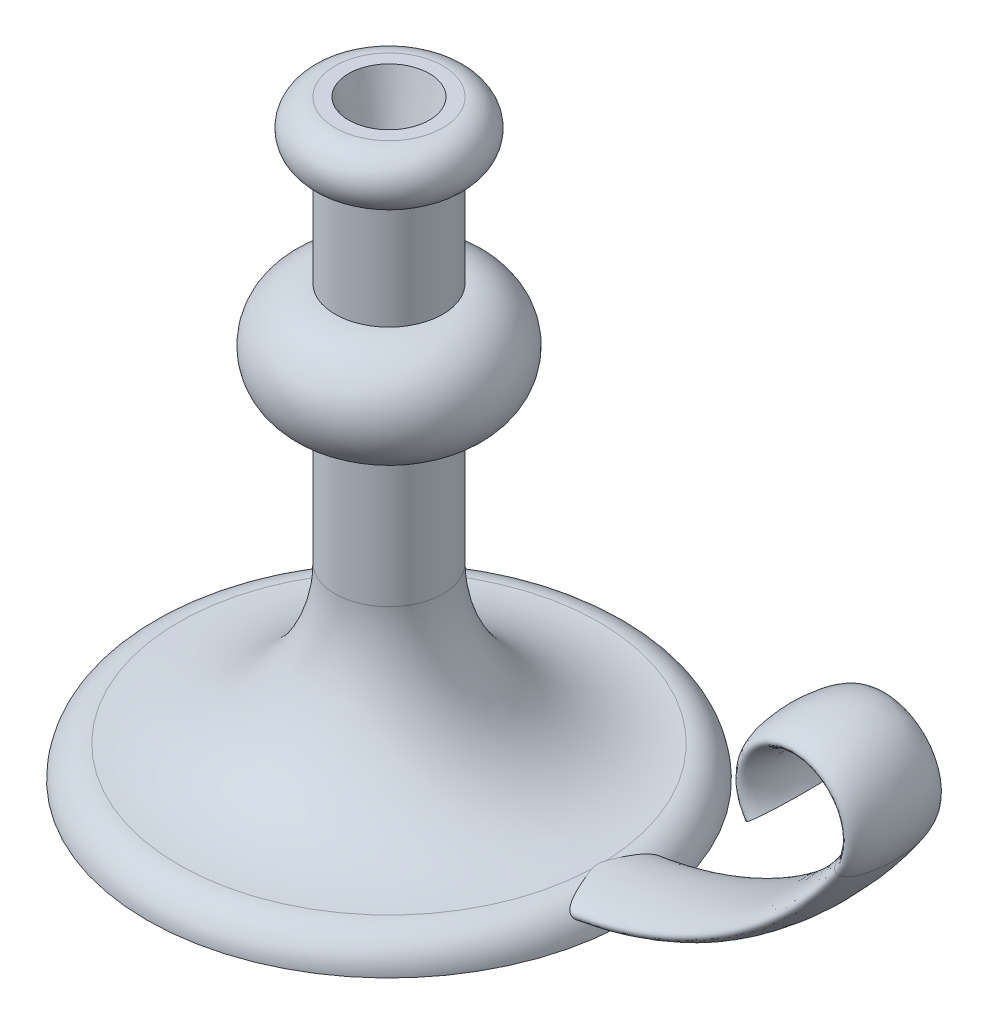
ISO-10303-21;
HEADER;
FILE_DESCRIPTION(('STEP AP214'),'2;1');
FILE_NAME('part.step','',(''),(''),'','','');
FILE_SCHEMA(('AUTOMOTIVE_DESIGN { 1 0 10303 214 1 1 1 1 }'));
ENDSEC;
DATA;
#1=APPLICATION_CONTEXT('core data for automotive mechanical design processes');
#2=APPLICATION_PROTOCOL_DEFINITION('international standard','automotive_design',2000,#1);
#3=PRODUCT_CONTEXT('',#1,'mechanical');
#4=PRODUCT('Part','Part','',(#3));
#5=PRODUCT_RELATED_PRODUCT_CATEGORY('part','',(#4));
#6=PRODUCT_DEFINITION_FORMATION('','',#4);
#7=PRODUCT_DEFINITION_CONTEXT('part definition',#1,'design');
#8=PRODUCT_DEFINITION('design','',#6,#7);
#9=PRODUCT_DEFINITION_SHAPE('','',#8);
#10=(LENGTH_UNIT() NAMED_UNIT(*) SI_UNIT(.MILLI.,.METRE.));
#11=(NAMED_UNIT(*) PLANE_ANGLE_UNIT() SI_UNIT($,.RADIAN.));
#12=(NAMED_UNIT(*) SI_UNIT($,.STERADIAN.) SOLID_ANGLE_UNIT());
#13=UNCERTAINTY_MEASURE_WITH_UNIT(LENGTH_MEASURE(1.E-05),#10,'distance_accuracy_value','');
#14=(GEOMETRIC_REPRESENTATION_CONTEXT(3) GLOBAL_UNCERTAINTY_ASSIGNED_CONTEXT((#13)) GLOBAL_UNIT_ASSIGNED_CONTEXT((#10,
#11,#12)) REPRESENTATION_CONTEXT('',''));
#15=CARTESIAN_POINT('',(0.,0.,0.));
#16=DIRECTION('',(0.,0.,1.));
#17=DIRECTION('',(1.,0.,0.));
#18=AXIS2_PLACEMENT_3D('',#15,#16,#17);
#19=CARTESIAN_POINT('',(0.,0.,0.));
#20=DIRECTION('',(0.,-1.,0.));
#21=DIRECTION('',(0.,0.,-1.));
#22=AXIS2_PLACEMENT_3D('',#19,#20,#21);
#23=PLANE('',#22);
#24=CARTESIAN_POINT('',(0.,0.,0.));
#25=DIRECTION('',(0.,-1.,0.));
#26=DIRECTION('',(0.,0.,-1.));
#27=AXIS2_PLACEMENT_3D('',#24,#25,#26);
#28=CIRCLE('',#27,90.);
#29=CARTESIAN_POINT('',(0.,0.,-90.));
#30=VERTEX_POINT('',#29);
#31=EDGE_CURVE('E69',#30,#30,#28,.T.);
#32=ORIENTED_EDGE('',*,*,#31,.T.);
#33=EDGE_LOOP('',(#32));
#34=FACE_BOUND('',#33,.T.);
#35=ADVANCED_FACE('F41',(#34),#23,.T.);
#36=CARTESIAN_POINT('',(0.,220.,0.));
#37=DIRECTION('',(0.,1.,0.));
#38=DIRECTION('',(0.,0.,1.));
#39=AXIS2_PLACEMENT_3D('',#36,#37,#38);
#40=PLANE('',#39);
#41=CARTESIAN_POINT('',(0.,220.,0.));
#42=DIRECTION('',(0.,1.,0.));
#43=DIRECTION('',(0.,0.,1.));
#44=AXIS2_PLACEMENT_3D('',#41,#42,#43);
#45=CIRCLE('',#44,15.);
#46=CARTESIAN_POINT('',(0.,220.,15.));
#47=VERTEX_POINT('',#46);
#48=EDGE_CURVE('E95',#47,#47,#45,.T.);
#49=ORIENTED_EDGE('',*,*,#48,.F.);
#50=EDGE_LOOP('',(#49));
#51=FACE_BOUND('',#50,.T.);
#52=CARTESIAN_POINT('',(0.,220.,0.));
#53=DIRECTION('',(0.,-1.,0.));
#54=DIRECTION('',(0.,0.,-1.));
#55=AXIS2_PLACEMENT_3D('',#52,#53,#54);
#56=CIRCLE('',#55,20.);
#57=CARTESIAN_POINT('',(0.,220.,-20.));
#58=VERTEX_POINT('',#57);
#59=EDGE_CURVE('E55',#58,#58,#56,.T.);
#60=ORIENTED_EDGE('',*,*,#59,.F.);
#61=EDGE_LOOP('',(#60));
#62=FACE_BOUND('',#61,.T.);
#63=ADVANCED_FACE('F138',(#51,#62),#40,.T.);
#64=CARTESIAN_POINT('',(0.,210.,0.));
#65=DIRECTION('',(0.,-1.,0.));
#66=DIRECTION('',(0.,0.,-1.));
#67=AXIS2_PLACEMENT_3D('',#64,#65,#66);
#68=TOROIDAL_SURFACE('',#67,20.,10.);
#69=ORIENTED_EDGE('',*,*,#59,.T.);
#70=EDGE_LOOP('',(#69));
#71=FACE_BOUND('',#70,.T.);
#72=CARTESIAN_POINT('',(0.,200.,0.));
#73=DIRECTION('',(0.,-1.,0.));
#74=DIRECTION('',(0.,0.,-1.));
#75=AXIS2_PLACEMENT_3D('',#72,#73,#74);
#76=CIRCLE('',#75,20.);
#77=CARTESIAN_POINT('',(0.,200.,-20.));
#78=VERTEX_POINT('',#77);
#79=EDGE_CURVE('E159',#78,#78,#76,.T.);
#80=ORIENTED_EDGE('',*,*,#79,.F.);
#81=EDGE_LOOP('',(#80));
#82=FACE_BOUND('',#81,.T.);
#83=ADVANCED_FACE('F143',(#71,#82),#68,.T.);
#84=CARTESIAN_POINT('',(0.,0.,0.));
#85=DIRECTION('',(0.,-1.,0.));
#86=DIRECTION('',(0.,0.,-1.));
#87=AXIS2_PLACEMENT_3D('',#84,#85,#86);
#88=CYLINDRICAL_SURFACE('',#87,20.);
#89=ORIENTED_EDGE('',*,*,#79,.T.);
#90=EDGE_LOOP('',(#89));
#91=FACE_BOUND('',#90,.T.);
#92=CARTESIAN_POINT('',(0.,160.,0.));
#93=DIRECTION('',(0.,-1.,0.));
#94=DIRECTION('',(0.,0.,-1.));
#95=AXIS2_PLACEMENT_3D('',#92,#93,#94);
#96=CIRCLE('',#95,20.);
#97=CARTESIAN_POINT('',(0.,160.,-20.));
#98=VERTEX_POINT('',#97);
#99=EDGE_CURVE('E155',#98,#98,#96,.T.);
#100=ORIENTED_EDGE('',*,*,#99,.F.);
#101=EDGE_LOOP('',(#100));
#102=FACE_BOUND('',#101,.T.);
#103=ADVANCED_FACE('F170',(#91,#102),#88,.T.);
#104=CARTESIAN_POINT('',(0.,140.,0.));
#105=DIRECTION('',(0.,-1.,0.));
#106=DIRECTION('',(0.,0.,-1.));
#107=AXIS2_PLACEMENT_3D('',#104,#105,#106);
#108=DEGENERATE_TOROIDAL_SURFACE('',#107,20.,20.,.T.);
#109=ORIENTED_EDGE('',*,*,#99,.T.);
#110=EDGE_LOOP('',(#109));
#111=FACE_BOUND('',#110,.T.);
#112=CARTESIAN_POINT('',(0.,120.,0.));
#113=DIRECTION('',(0.,-1.,0.));
#114=DIRECTION('',(0.,0.,-1.));
#115=AXIS2_PLACEMENT_3D('',#112,#113,#114);
#116=CIRCLE('',#115,20.);
#117=CARTESIAN_POINT('',(0.,120.,-20.));
#118=VERTEX_POINT('',#117);
#119=EDGE_CURVE('E151',#118,#118,#116,.T.);
#120=ORIENTED_EDGE('',*,*,#119,.F.);
#121=EDGE_LOOP('',(#120));
#122=FACE_BOUND('',#121,.T.);
#123=ADVANCED_FACE('F176',(#111,#122),#108,.T.);
#124=CARTESIAN_POINT('',(0.,0.,0.));
#125=DIRECTION('',(0.,-1.,0.));
#126=DIRECTION('',(0.,0.,-1.));
#127=AXIS2_PLACEMENT_3D('',#124,#125,#126);
#128=CYLINDRICAL_SURFACE('',#127,20.);
#129=ORIENTED_EDGE('',*,*,#119,.T.);
#130=EDGE_LOOP('',(#129));
#131=FACE_BOUND('',#130,.T.);
#132=CARTESIAN_POINT('',(0.,70.,0.));
#133=DIRECTION('',(0.,-1.,0.));
#134=DIRECTION('',(0.,0.,-1.));
#135=AXIS2_PLACEMENT_3D('',#132,#133,#134);
#136=CIRCLE('',#135,20.);
#137=CARTESIAN_POINT('',(0.,70.,-20.));
#138=VERTEX_POINT('',#137);
#139=EDGE_CURVE('E68',#138,#138,#136,.T.);
#140=ORIENTED_EDGE('',*,*,#139,.F.);
#141=EDGE_LOOP('',(#140));
#142=FACE_BOUND('',#141,.T.);
#143=ADVANCED_FACE('F136',(#131,#142),#128,.T.);
#144=CARTESIAN_POINT('',(0.,70.,0.));
#145=DIRECTION('',(0.,-1.,0.));
#146=DIRECTION('',(0.,0.,-1.));
#147=AXIS2_PLACEMENT_3D('',#144,#145,#146);
#148=TOROIDAL_SURFACE('',#147,78.132526458804,58.132526458804);
#149=CARTESIAN_POINT('',(78.0829144180408,11.867473541196,-2.78391214312258));
#150=CARTESIAN_POINT('',(78.0034178417161,11.8674839988395,-2.56875903160674));
#151=CARTESIAN_POINT('',(77.9332196184629,11.8676699524661,-2.35017667179376));
#152=CARTESIAN_POINT('',(77.811805042004,11.868194388353,-1.90784794183037));
#153=CARTESIAN_POINT('',(77.7605849191874,11.868532840293,-1.68410260658854));
#154=CARTESIAN_POINT('',(77.6786784850846,11.869154868186,-1.23956128413428));
#155=CARTESIAN_POINT('',(77.6474424557957,11.8694397455078,-1.01886640772483));
#156=CARTESIAN_POINT('',(77.6033658733518,11.8698601874895,-0.575640526980788));
#157=CARTESIAN_POINT('',(77.5905263444912,11.8699957438354,-0.353109421100969));
#158=CARTESIAN_POINT('',(77.5829791210356,11.8700736774626,0.113314758134888));
#159=CARTESIAN_POINT('',(77.5900991076185,11.8699965934252,0.357239719211034));
#160=CARTESIAN_POINT('',(77.6264217338159,11.8696368687455,0.8434491291199));
#161=CARTESIAN_POINT('',(77.6556268809198,11.8693542047624,1.08573338852002));
#162=CARTESIAN_POINT('',(77.7372563767673,11.868695649815,1.57451497171925));
#163=CARTESIAN_POINT('',(77.7904048790381,11.8683170262126,1.8208931030878));
#164=CARTESIAN_POINT('',(77.8873061225065,11.8678591917707,2.1858254435987));
#165=CARTESIAN_POINT('',(77.9224776324587,11.8677249159516,2.30671879205611));
#166=CARTESIAN_POINT('',(77.9984741417738,11.8675323896527,2.5467153675248));
#167=CARTESIAN_POINT('',(78.0392991425871,11.8674741391925,2.66581859407688));
#168=CARTESIAN_POINT('',(78.0829144180408,11.867473541196,2.78391214312255));
#169=B_SPLINE_CURVE_WITH_KNOTS('',3,(#149,#150,#151,#152,#153,#154,#155,#156,#157,#158,#159,
#160,#161,#162,#163,#164,#165,#166,#167,#168),.UNSPECIFIED.,.F.,.F.,(4,2,2,2,2,2,2,2,2,4),(0.,
0.687891249862493,1.37564579087687,2.04356060088577,2.71151259811932,3.44257184885006,
4.17371411453313,4.92863144645206,5.30622841442645,5.68382547926132),.UNSPECIFIED.);
#170=CARTESIAN_POINT('',(78.0829144180408,11.867473541196,-2.78391214312256));
#171=VERTEX_POINT('',#170);
#172=CARTESIAN_POINT('',(78.0829144180408,11.867473541196,2.78391214312251));
#173=VERTEX_POINT('',#172);
#174=EDGE_CURVE('E71',#171,#173,#169,.T.);
#175=ORIENTED_EDGE('',*,*,#174,.F.);
#176=CARTESIAN_POINT('',(0.,11.867473541196,0.));
#177=DIRECTION('',(0.,-1.,0.));
#178=DIRECTION('',(0.,0.,-1.));
#179=AXIS2_PLACEMENT_3D('',#176,#177,#178);
#180=CIRCLE('',#179,78.132526458804);
#181=EDGE_CURVE('E61',#173,#171,#180,.T.);
#182=ORIENTED_EDGE('',*,*,#181,.F.);
#183=EDGE_LOOP('',(#175,#182));
#184=FACE_BOUND('',#183,.T.);
#185=ORIENTED_EDGE('',*,*,#139,.T.);
#186=EDGE_LOOP('',(#185));
#187=FACE_BOUND('',#186,.T.);
#188=ADVANCED_FACE('F72',(#184,#187),#148,.F.);
#189=CARTESIAN_POINT('',(0.,0.,0.));
#190=DIRECTION('',(0.,-1.,0.));
#191=DIRECTION('',(0.,0.,-1.));
#192=AXIS2_PLACEMENT_3D('',#189,#190,#191);
#193=TOROIDAL_SURFACE('',#192,78.132526458804,11.867473541196);
#194=CARTESIAN_POINT('',(78.0829144180408,11.867473541196,2.78391214312251));
#195=CARTESIAN_POINT('',(78.1332858205503,11.8674759985882,2.92022664744843));
#196=CARTESIAN_POINT('',(78.1840686851779,11.8670886000006,3.05638794075109));
#197=CARTESIAN_POINT('',(78.2861981859076,11.8654881673345,3.3284936679438));
#198=CARTESIAN_POINT('',(78.337544819978,11.8642751362302,3.46443810261328));
#199=CARTESIAN_POINT('',(78.440592063587,11.8609759471981,3.73632991718496));
#200=CARTESIAN_POINT('',(78.49229296339,11.8588889597795,3.87227717686807));
#201=CARTESIAN_POINT('',(78.5958582066355,11.8538068441193,4.14409235409665));
#202=CARTESIAN_POINT('',(78.6477225502213,11.8508117150809,4.27996027157239));
#203=CARTESIAN_POINT('',(78.8034675333041,11.8404115348024,4.68767200254305));
#204=CARTESIAN_POINT('',(78.9074334947624,11.8315937289644,4.95944887114404));
#205=CARTESIAN_POINT('',(79.1151922799917,11.8099544577082,5.50302509401507));
#206=CARTESIAN_POINT('',(79.2189850254412,11.7971315117002,5.77482441937878));
#207=CARTESIAN_POINT('',(79.4262222433445,11.7672443080693,6.31836420650816));
#208=CARTESIAN_POINT('',(79.5296666694147,11.7501795065917,6.59010465625045));
#209=CARTESIAN_POINT('',(79.7373630561895,11.7113283911726,7.1364972016642));
#210=CARTESIAN_POINT('',(79.8416108150557,11.6894905701872,7.41114725070465));
#211=CARTESIAN_POINT('',(80.0498141920577,11.6409039389752,7.96006818154131));
#212=CARTESIAN_POINT('',(80.1537698596935,11.6141560190807,8.23433912301035));
#213=CARTESIAN_POINT('',(80.3615705733899,11.5553875575139,8.7822789310992));
#214=CARTESIAN_POINT('',(80.4654156410094,11.5233683722242,9.05594793429787));
#215=CARTESIAN_POINT('',(80.6732691346772,11.4536206608184,9.60241678337918));
#216=CARTESIAN_POINT('',(80.7772775118252,11.4158936056617,9.8752168347561));
#217=CARTESIAN_POINT('',(80.9858374144413,11.334191725825,10.4196321677995));
#218=CARTESIAN_POINT('',(81.0903888590435,11.2902178070196,10.6912476153727));
#219=CARTESIAN_POINT('',(81.2826479104597,11.2034206554867,11.1867615452376));
#220=CARTESIAN_POINT('',(81.3701930086615,11.1616759149781,11.410911666338));
#221=CARTESIAN_POINT('',(81.5463686891743,11.0729356336802,11.8577708897263));
#222=CARTESIAN_POINT('',(81.6349993656717,11.0259396343683,12.0804798643789));
#223=CARTESIAN_POINT('',(81.8138194139794,10.9260934431771,12.5240498252789));
#224=CARTESIAN_POINT('',(81.9040092978742,10.8732412959291,12.7449101676321));
#225=CARTESIAN_POINT('',(82.0864803188138,10.7609628934924,13.1840394622447));
#226=CARTESIAN_POINT('',(82.1787610235362,10.7015379876754,13.4023089362521));
#227=CARTESIAN_POINT('',(82.3661640345518,10.5751661358235,13.8353732829513));
#228=CARTESIAN_POINT('',(82.4612856309817,10.5082210575245,14.0501690033024));
#229=CARTESIAN_POINT('',(82.6553445356343,10.3655856023384,14.4749757857705));
#230=CARTESIAN_POINT('',(82.7542797001199,10.2899000923293,14.6849894334044));
#231=CARTESIAN_POINT('',(82.9325248212082,10.1478781212611,15.0477988055398));
#232=CARTESIAN_POINT('',(83.0107123856304,10.0837864593731,15.2020195398539));
#233=CARTESIAN_POINT('',(83.1708954269159,9.94865203519248,15.5054871547856));
#234=CARTESIAN_POINT('',(83.2528923910753,9.87760654574407,15.6547320529667));
#235=CARTESIAN_POINT('',(83.4213168469832,9.72769213079579,15.9457218062268));
#236=CARTESIAN_POINT('',(83.5077243859348,9.64885714942943,16.0874954044401));
#237=CARTESIAN_POINT('',(83.6864528949685,9.48170334086076,16.361274891524));
#238=CARTESIAN_POINT('',(83.7787675581541,9.39339456261682,16.4932908841141));
#239=CARTESIAN_POINT('',(83.956401145631,9.21963534746911,16.7243891785783));
#240=CARTESIAN_POINT('',(84.0406677737753,9.13577114577394,16.8254331104551));
#241=CARTESIAN_POINT('',(84.1718277558071,9.00305417732087,16.9662248372236));
#242=CARTESIAN_POINT('',(84.2163788462501,8.95762240687117,17.0113917015562));
#243=CARTESIAN_POINT('',(84.3071572532483,8.86435477304841,17.0974102559331));
#244=CARTESIAN_POINT('',(84.3533848684972,8.81651848068836,17.1382611719143));
#245=CARTESIAN_POINT('',(84.4482733429297,8.71765998061532,17.2154157756223));
#246=CARTESIAN_POINT('',(84.4969609608077,8.66659962846712,17.2516382903156));
#247=CARTESIAN_POINT('',(84.5959984767066,8.56210210962373,17.3177794650122));
#248=CARTESIAN_POINT('',(84.6463473037986,8.50866646677419,17.3477020979264));
#249=CARTESIAN_POINT('',(84.7483991104385,8.39979466237416,17.4001728360828));
#250=CARTESIAN_POINT('',(84.8000979608695,8.34436444072553,17.4227411029409));
#251=CARTESIAN_POINT('',(84.904606191607,8.23183948066789,17.4596482337605));
#252=CARTESIAN_POINT('',(84.9574150400769,8.17474553455662,17.4739909497031));
#253=CARTESIAN_POINT('',(85.0496996712227,8.07465129447633,17.491154771647));
#254=CARTESIAN_POINT('',(85.0890472091098,8.03187375514774,17.4960090177583));
#255=CARTESIAN_POINT('',(85.1677986427243,7.94610098292568,17.5007001197072));
#256=CARTESIAN_POINT('',(85.2072025279551,7.90310578753893,17.5005378124247));
#257=CARTESIAN_POINT('',(85.2858069971304,7.81722558918855,17.4951751236272));
#258=CARTESIAN_POINT('',(85.3250075342474,7.77434061266189,17.4899736293093));
#259=CARTESIAN_POINT('',(85.4029280946959,7.68902725455244,17.474666642996));
#260=CARTESIAN_POINT('',(85.4416480888576,7.64659890070804,17.4645608547797));
#261=CARTESIAN_POINT('',(85.5563443502292,7.52087513940319,17.4273523856781));
#262=CARTESIAN_POINT('',(85.631317253979,7.43863707796102,17.3933227125755));
#263=CARTESIAN_POINT('',(85.7771695059256,7.27878151652804,17.3096535949428));
#264=CARTESIAN_POINT('',(85.848045901393,7.20116734819203,17.2600030530961));
#265=CARTESIAN_POINT('',(86.0324323694524,6.99964451691603,17.1099514783304));
#266=CARTESIAN_POINT('',(86.1418420675393,6.88049495365715,16.9980987061639));
#267=CARTESIAN_POINT('',(86.296785592954,6.71260018626944,16.8133206247178));
#268=CARTESIAN_POINT('',(86.3469968828002,6.65834176496262,16.7487472496471));
#269=CARTESIAN_POINT('',(86.444619704994,6.55314440736801,16.6149334305057));
#270=CARTESIAN_POINT('',(86.4920318183417,6.50220478199867,16.5456939613688));
#271=CARTESIAN_POINT('',(86.6286181671464,6.35589514832335,16.3351179437607));
#272=CARTESIAN_POINT('',(86.7141536424315,6.26485627327341,16.1884230072953));
#273=CARTESIAN_POINT('',(86.8770843399172,6.09248852543153,15.8851016516813));
#274=CARTESIAN_POINT('',(86.9544711948755,6.01116962203508,15.7284652837814));
#275=CARTESIAN_POINT('',(87.1025475226786,5.85651903770118,15.4077703114903));
#276=CARTESIAN_POINT('',(87.1732211383789,5.78320620946138,15.2436954229642));
#277=CARTESIAN_POINT('',(87.3086763184139,5.64354093539106,14.9103751770391));
#278=CARTESIAN_POINT('',(87.3734603460299,5.5771855778473,14.7411320211687));
#279=CARTESIAN_POINT('',(87.5000072427105,5.44832985186805,14.3930271646988));
#280=CARTESIAN_POINT('',(87.5616017753118,5.38602680140933,14.2140319621912));
#281=CARTESIAN_POINT('',(87.6800789163603,5.26688451343781,13.8526773494805));
#282=CARTESIAN_POINT('',(87.7369607322456,5.21004619470047,13.6703173796867));
#283=CARTESIAN_POINT('',(87.8466111002026,5.1010891390858,13.3026500889995));
#284=CARTESIAN_POINT('',(87.8993732000969,5.04897778558835,13.117338671214));
#285=CARTESIAN_POINT('',(88.0011025301256,4.94903597157326,12.7445263525517));
#286=CARTESIAN_POINT('',(88.0500694369844,4.90120587568069,12.5570252667201));
#287=CARTESIAN_POINT('',(88.1918545853316,4.76340349979638,11.9915675439686));
#288=CARTESIAN_POINT('',(88.2794872791204,4.67918837567283,11.6108952544418));
#289=CARTESIAN_POINT('',(88.4431391187063,4.52325418478706,10.8432786097806));
#290=CARTESIAN_POINT('',(88.5191200897792,4.45157608984194,10.456318046235));
#291=CARTESIAN_POINT('',(88.6603959989167,4.31929642694951,9.67902198080352));
#292=CARTESIAN_POINT('',(88.7257020536162,4.25868332836108,9.28869044129987));
#293=CARTESIAN_POINT('',(88.8466564405423,4.14714292480802,8.5052709614834));
#294=CARTESIAN_POINT('',(88.9023069783831,4.09621340756295,8.11218367206934));
#295=CARTESIAN_POINT('',(89.0062715521613,4.00158579641787,7.31135768670015));
#296=CARTESIAN_POINT('',(89.0542978004733,3.95816744116994,6.90354888832833));
#297=CARTESIAN_POINT('',(89.1413768883764,3.87980264147868,6.08607779994615));
#298=CARTESIAN_POINT('',(89.18042771216,3.84485810008823,5.67641511459293));
#299=CARTESIAN_POINT('',(89.2499396951377,3.78287872225844,4.8557440677656));
#300=CARTESIAN_POINT('',(89.2804001986671,3.75584448957546,4.44473560599446));
#301=CARTESIAN_POINT('',(89.3460650003117,3.69771452494742,3.41769003908219));
#302=CARTESIAN_POINT('',(89.3761310631696,3.67125280804496,2.80105258752198));
#303=CARTESIAN_POINT('',(89.4182686885379,3.6342184315108,1.56668069973948));
#304=CARTESIAN_POINT('',(89.430339412896,3.62364651196338,0.948946213763159));
#305=CARTESIAN_POINT('',(89.4365949414496,3.61816432502569,-0.266238369004212));
#306=CARTESIAN_POINT('',(89.4313584069666,3.62274736033785,-0.863683249201871));
#307=CARTESIAN_POINT('',(89.4041704685681,3.64660426005269,-2.05802228538358));
#308=CARTESIAN_POINT('',(89.3822157496816,3.66588103801001,-2.65491630863662));
#309=CARTESIAN_POINT('',(89.3211910243096,3.71970928834563,-3.84742470271281));
#310=CARTESIAN_POINT('',(89.2821133005466,3.75426764814309,-4.44303837471157));
#311=CARTESIAN_POINT('',(89.1859366512918,3.83989473584046,-5.63371381328731));
#312=CARTESIAN_POINT('',(89.128775946006,3.89102007896777,-6.22876656764166));
#313=CARTESIAN_POINT('',(88.9952765371682,4.01149571621043,-7.41471976927656));
#314=CARTESIAN_POINT('',(88.9189448617358,4.08083933189544,-8.00562165684494));
#315=CARTESIAN_POINT('',(88.7886089282295,4.20060631678663,-8.88723405985461));
#316=CARTESIAN_POINT('',(88.7425427086701,4.24313632566967,-9.18021341272784));
#317=CARTESIAN_POINT('',(88.6447638466676,4.33395559779652,-9.76432515597012));
#318=CARTESIAN_POINT('',(88.5930515513723,4.38224450697238,-10.0554576587291));
#319=CARTESIAN_POINT('',(88.4833646726485,4.48535505123301,-10.6363431687204));
#320=CARTESIAN_POINT('',(88.4253712670681,4.54019637511359,-10.9260891520265));
#321=CARTESIAN_POINT('',(88.3026480536119,4.65710809885415,-11.5027659615388));
#322=CARTESIAN_POINT('',(88.2379168132693,4.71918003628156,-11.7896961748639));
#323=CARTESIAN_POINT('',(88.1008728878357,4.85166066720993,-12.3601403999835));
#324=CARTESIAN_POINT('',(88.0285525138311,4.92207782517665,-12.6436506162721));
#325=CARTESIAN_POINT('',(87.8757590889499,5.07216770711925,-13.2041495709318));
#326=CARTESIAN_POINT('',(87.7953362328181,5.15178384638737,-13.48116676699));
#327=CARTESIAN_POINT('',(87.6672497175876,5.27979712638673,-13.8915679539802));
#328=CARTESIAN_POINT('',(87.6233268789287,5.32388480055065,-14.0274730926433));
#329=CARTESIAN_POINT('',(87.532740556465,5.41524694162963,-14.2972790296524));
#330=CARTESIAN_POINT('',(87.4860773116472,5.46252113070601,-14.4311800015049));
#331=CARTESIAN_POINT('',(87.3897883458704,5.56055280709812,-14.6963750466249));
#332=CARTESIAN_POINT('',(87.3401671505808,5.6113049900179,-14.8276727125796));
#333=CARTESIAN_POINT('',(87.2375500348129,5.71679275317666,-15.0873016428778));
#334=CARTESIAN_POINT('',(87.1845546875213,5.77152765707222,-15.2156334060347));
#335=CARTESIAN_POINT('',(87.0792267072779,5.88087475434541,-15.4582869011583));
#336=CARTESIAN_POINT('',(87.0271930947601,5.93513225680263,-15.5728971513154));
#337=CARTESIAN_POINT('',(86.9194787490348,6.04798540208354,-15.7982564320595));
#338=CARTESIAN_POINT('',(86.8637973063179,6.10658188913797,-15.909004705028));
#339=CARTESIAN_POINT('',(86.7483653028598,6.22863250391223,-16.1254274479559));
#340=CARTESIAN_POINT('',(86.6886195965948,6.29208084730128,-16.2311077225916));
#341=CARTESIAN_POINT('',(86.5644518830464,6.42455005821582,-16.4359834236517));
#342=CARTESIAN_POINT('',(86.5000321896646,6.49356817024884,-16.5351820132872));
#343=CARTESIAN_POINT('',(86.351078658137,6.65384260947307,-16.7459637354926));
#344=CARTESIAN_POINT('',(86.2652349084894,6.74665354638892,-16.8554805760182));
#345=CARTESIAN_POINT('',(86.0845317049062,6.94289891175121,-17.0561662603524));
#346=CARTESIAN_POINT('',(85.9896847036244,7.04631868234736,-17.1473599183333));
#347=CARTESIAN_POINT('',(85.8140529773968,7.23836849271698,-17.2849582370784));
#348=CARTESIAN_POINT('',(85.7352130560094,7.32475000412457,-17.3368528560035));
#349=CARTESIAN_POINT('',(85.6135640123369,7.45811522545701,-17.3998474815334));
#350=CARTESIAN_POINT('',(85.5724565682855,7.50319466872134,-17.4183692984036));
#351=CARTESIAN_POINT('',(85.4893073357255,7.59436089215198,-17.450008959007));
#352=CARTESIAN_POINT('',(85.4472659888213,7.64044719605183,-17.4631293018663));
#353=CARTESIAN_POINT('',(85.3621780989603,7.73365549566588,-17.4836721542133));
#354=CARTESIAN_POINT('',(85.3191262389945,7.78078279688333,-17.4910488361212));
#355=CARTESIAN_POINT('',(85.2326820759553,7.87528698119339,-17.4997123345764));
#356=CARTESIAN_POINT('',(85.1892897750596,7.9226638626888,-17.5009991900486));
#357=CARTESIAN_POINT('',(85.1025117310288,8.01722854805267,-17.4974635326557));
#358=CARTESIAN_POINT('',(85.0591259965935,8.06441627356095,-17.4926387070213));
#359=CARTESIAN_POINT('',(84.9727362022126,8.15813750525422,-17.4770779609617));
#360=CARTESIAN_POINT('',(84.9297321388953,8.20467101722087,-17.4663420928096));
#361=CARTESIAN_POINT('',(84.81043941936,8.33334239796853,-17.4285434819466));
#362=CARTESIAN_POINT('',(84.7348694744599,8.41437503798224,-17.3952862177984));
#363=CARTESIAN_POINT('',(84.5870958825281,8.57163559210867,-17.3138013012863));
#364=CARTESIAN_POINT('',(84.514892969307,8.6478624601141,-17.2655704029463));
#365=CARTESIAN_POINT('',(84.3815656022667,8.78733100309432,-17.1629562749585));
#366=CARTESIAN_POINT('',(84.3200722622574,8.85109696520525,-17.1097440270938));
#367=CARTESIAN_POINT('',(84.199961383993,8.97447836187207,-16.9957362541792));
#368=CARTESIAN_POINT('',(84.1413459955406,9.03409070723808,-16.9349351769099));
#369=CARTESIAN_POINT('',(84.0266468089127,9.1495264904193,-16.8071498159727));
#370=CARTESIAN_POINT('',(83.970571805781,9.20533705884134,-16.7401461819898));
#371=CARTESIAN_POINT('',(83.8609019861302,9.3132507344446,-16.6013725763381));
#372=CARTESIAN_POINT('',(83.8073065814913,9.36535472235804,-16.5296037448315));
#373=CARTESIAN_POINT('',(83.6629346962951,9.50400133467757,-16.327019261638));
#374=CARTESIAN_POINT('',(83.5743892507795,9.58709537495994,-16.1922540785554));
#375=CARTESIAN_POINT('',(83.4024829021902,9.74471767100902,-15.9144227888771));
#376=CARTESIAN_POINT('',(83.3191306303351,9.8192318323246,-15.7713435886337));
#377=CARTESIAN_POINT('',(83.1565751123243,9.96093783446005,-15.4791904042741));
#378=CARTESIAN_POINT('',(83.0773751366342,10.0281239471949,-15.3301118535157));
#379=CARTESIAN_POINT('',(82.9219511677601,10.1564649945308,-15.0268549457862));
#380=CARTESIAN_POINT('',(82.8457434378859,10.2175891567717,-14.8726553938577));
#381=CARTESIAN_POINT('',(82.6960942207366,10.3342200311586,-14.5610563435882));
#382=CARTESIAN_POINT('',(82.6226500471964,10.3897322917049,-14.4036601943335));
#383=CARTESIAN_POINT('',(82.4779238673778,10.4958623091831,-14.0863071674406));
#384=CARTESIAN_POINT('',(82.4066413497708,10.5464812299055,-13.9263509092774));
#385=CARTESIAN_POINT('',(82.2635749307577,10.644898963138,-13.5993316587525));
#386=CARTESIAN_POINT('',(82.1918456401752,10.6925592065307,-13.4322032790857));
#387=CARTESIAN_POINT('',(82.0498279824856,10.783735939546,-13.0962085020623));
#388=CARTESIAN_POINT('',(81.9795397039625,10.8272521750179,-12.9273419988099));
#389=CARTESIAN_POINT('',(81.7702697897489,10.9522417704549,-12.418447807054));
#390=CARTESIAN_POINT('',(81.632975396384,11.0280929983894,-12.0763393777875));
#391=CARTESIAN_POINT('',(81.3610143649754,11.1672138557865,-11.3884581197091));
#392=CARTESIAN_POINT('',(81.2263486054769,11.23047934163,-11.0426841234118));
#393=CARTESIAN_POINT('',(80.9587275149256,11.3459596163474,-10.3495611198501));
#394=CARTESIAN_POINT('',(80.8257690309761,11.3981988144672,-10.0022173677705));
#395=CARTESIAN_POINT('',(80.5604259576263,11.4930393298969,-9.30617805254364));
#396=CARTESIAN_POINT('',(80.4280411543284,11.5356446095978,-8.95748310537905));
#397=CARTESIAN_POINT('',(80.1631880834157,11.6122002593312,-8.25922601111861));
#398=CARTESIAN_POINT('',(80.0307198266452,11.6461515856028,-7.90966396414881));
#399=CARTESIAN_POINT('',(79.7974687391313,11.698886418247,-7.29483988385474));
#400=CARTESIAN_POINT('',(79.6967881442597,11.7193517302395,-7.02968103398105));
#401=CARTESIAN_POINT('',(79.4950670051124,11.7560230856823,-6.49918946298806));
#402=CARTESIAN_POINT('',(79.3940264417437,11.7722288996905,-6.23385673327399));
#403=CARTESIAN_POINT('',(79.1916025567738,11.8006212397799,-5.70309287080766));
#404=CARTESIAN_POINT('',(79.0902192176071,11.8128075566292,-5.43766173365263));
#405=CARTESIAN_POINT('',(78.8874463719012,11.8333611226965,-4.90718261266012));
#406=CARTESIAN_POINT('',(78.7860571813174,11.8417349620334,-4.64213476316163));
#407=CARTESIAN_POINT('',(78.6341611508738,11.8516177956669,-4.24443585175106));
#408=CARTESIAN_POINT('',(78.5835617647891,11.8544657128647,-4.1118518554451));
#409=CARTESIAN_POINT('',(78.482527113561,11.8592991137406,-3.84660556049084));
#410=CARTESIAN_POINT('',(78.4320918482657,11.8612845982165,-3.71394326191509));
#411=CARTESIAN_POINT('',(78.3315286527069,11.8644256612423,-3.44851509325107));
#412=CARTESIAN_POINT('',(78.2814006773471,11.8655813646042,-3.31574924174758));
#413=CARTESIAN_POINT('',(78.1816885490147,11.8671064374488,-3.05000855527584));
#414=CARTESIAN_POINT('',(78.1321043980601,11.8674758040145,-2.91703371953419));
#415=CARTESIAN_POINT('',(78.0829144180408,11.867473541196,-2.78391214312256));
#416=B_SPLINE_CURVE_WITH_KNOTS('',3,(#194,#195,#196,#197,#198,#199,#200,#201,#202,#203,#204,
#205,#206,#207,#208,#209,#210,#211,#212,#213,#214,#215,#216,#217,#218,#219,#220,#221,#222,#223,
#224,#225,#226,#227,#228,#229,#230,#231,#232,#233,#234,#235,#236,#237,#238,#239,#240,#241,#242,
#243,#244,#245,#246,#247,#248,#249,#250,#251,#252,#253,#254,#255,#256,#257,#258,#259,#260,#261,
#262,#263,#264,#265,#266,#267,#268,#269,#270,#271,#272,#273,#274,#275,#276,#277,#278,#279,#280,
#281,#282,#283,#284,#285,#286,#287,#288,#289,#290,#291,#292,#293,#294,#295,#296,#297,#298,#299,
#300,#301,#302,#303,#304,#305,#306,#307,#308,#309,#310,#311,#312,#313,#314,#315,#316,#317,#318,
#319,#320,#321,#322,#323,#324,#325,#326,#327,#328,#329,#330,#331,#332,#333,#334,#335,#336,#337,
#338,#339,#340,#341,#342,#343,#344,#345,#346,#347,#348,#349,#350,#351,#352,#353,#354,#355,#356,
#357,#358,#359,#360,#361,#362,#363,#364,#365,#366,#367,#368,#369,#370,#371,#372,#373,#374,#375,
#376,#377,#378,#379,#380,#381,#382,#383,#384,#385,#386,#387,#388,#389,#390,#391,#392,#393,#394,
#395,#396,#397,#398,#399,#400,#401,#402,#403,#404,#405,#406,#407,#408,#409,#410,#411,#412,#413,
#414,#415),.UNSPECIFIED.,.F.,.F.,(4,2,2,2,2,2,2,2,2,2,2,2,2,2,2,2,2,2,2,2,2,2,2,2,2,2,2,2,2,2,2,
2,2,2,2,2,2,2,2,2,2,2,2,2,2,2,2,2,2,2,2,2,2,2,2,2,2,2,2,2,2,2,2,2,2,2,2,2,2,2,2,2,2,2,2,2,2,2,2,
2,2,2,2,2,2,2,2,2,2,2,2,2,2,2,2,2,2,2,2,2,2,2,2,2,2,2,2,2,2,2,4),(0.,0.435967807477158,
0.871934044462651,1.30831500764633,1.74469635376575,2.61802058976206,3.49166805245182,
4.36542758457882,5.24912771727423,6.13266776952605,7.0159808268369,7.8990666345235,
8.78202451402682,9.51467096869945,10.2473814457096,10.9803373163434,11.713142991199,
12.4457670646448,13.1779851450517,13.7310133941385,14.284259405856,14.8351927943226,
15.3855474740844,15.8526988992042,16.0866512873009,16.3206455636554,16.5583019951389,
16.7958081008076,17.0326575082853,17.2693959097093,17.4441667307612,17.618908396057,
17.7936886583245,17.9684794786877,18.3160360520443,18.6638400948474,19.2501926669119,
19.5445588436836,19.8388637051378,20.4159125090124,20.9935481810078,21.5725160009411,
22.1512405465482,22.7489110390255,23.3466818416859,23.9453708207545,24.5441107403964,
25.7423643633722,26.9444636186855,28.1453029457902,29.3458676024314,30.5844125443114,
31.8232353820914,33.0621527486943,34.9154459844641,36.7688255366718,38.5608731757487,
40.3532762441727,42.1464879745427,43.9458935355079,45.7446403909003,46.6433870025316,
47.5420783860007,48.4435414991136,49.3451966566901,50.2477743090147,51.1450692140575,
51.5934399821666,52.0417717063665,52.4894342623878,52.9370209732362,53.3480719880203,
53.7592031916976,54.1698516698527,54.5802982217664,55.080907379405,55.5808339485508,
55.9630893848382,56.1541537471769,56.3451296092287,56.53761404656,56.7300972535711,
56.9226533214287,57.1152076864844,57.4608445251901,57.8065563432397,58.1161121127058,
58.4258957049956,58.7366805879045,59.0473913758614,59.5909152292212,60.1353195794244,
60.6801464674514,61.227610935938,61.7745287295336,62.3213161271568,62.8852826270542,
63.4492836925942,64.5780092736537,65.7071058536187,66.8336760753467,67.959782097141,
69.0857636331762,69.9388333729506,70.7919490547906,71.6451091379288,72.4967888256597,
72.9226062182308,73.3484232168885,73.774176152544,74.199930667535),.UNSPECIFIED.);
#417=EDGE_CURVE('E11',#173,#171,#416,.T.);
#418=ORIENTED_EDGE('',*,*,#417,.F.);
#419=ORIENTED_EDGE('',*,*,#181,.T.);
#420=EDGE_LOOP('',(#418,#419));
#421=FACE_BOUND('',#420,.T.);
#422=ORIENTED_EDGE('',*,*,#31,.F.);
#423=EDGE_LOOP('',(#422));
#424=FACE_BOUND('',#423,.T.);
#425=ADVANCED_FACE('F63',(#421,#424),#193,.T.);
#426=CARTESIAN_POINT('',(150.634185358261,70.7996699527904,0.));
#427=DIRECTION('',(0.566666666666666,-0.823947139620552,0.));
#428=DIRECTION('',(0.,0.,-1.));
#429=AXIS2_PLACEMENT_3D('',#426,#427,#428);
#430=PLANE('',#429);
#431=CARTESIAN_POINT('',(150.634185358261,70.7996699527904,0.));
#432=DIRECTION('',(0.566666666666666,-0.823947139620552,0.));
#433=DIRECTION('',(0.,0.,-1.));
#434=AXIS2_PLACEMENT_3D('',#431,#432,#433);
#435=ELLIPSE('',#434,17.5,5.);
#436=CARTESIAN_POINT('',(150.634185358261,70.7996699527904,-17.5));
#437=VERTEX_POINT('',#436);
#438=EDGE_CURVE('E76',#437,#437,#435,.T.);
#439=ORIENTED_EDGE('',*,*,#438,.T.);
#440=EDGE_LOOP('',(#439));
#441=FACE_BOUND('',#440,.T.);
#442=ADVANCED_FACE('F82',(#441),#430,.T.);
#443=CARTESIAN_POINT('',(60.,5.79966995279041,-17.5));
#444=CARTESIAN_POINT('',(110.410191303973,5.7996699527904,-17.5));
#445=CARTESIAN_POINT('',(155.026295870831,29.2643370201569,-17.5));
#446=CARTESIAN_POINT('',(183.592070943083,70.7996699527904,-17.5));
#447=CARTESIAN_POINT('',(60.,15.7996699527904,-17.5));
#448=CARTESIAN_POINT('',(107.049511883708,15.7996699527904,-17.5));
#449=CARTESIAN_POINT('',(148.691209479443,37.7000258823325,-17.5));
#450=CARTESIAN_POINT('',(175.352599546877,76.466336619457,-17.5));
#451=CARTESIAN_POINT('',(60.,15.7996699527904,17.5));
#452=CARTESIAN_POINT('',(107.049511883708,15.7996699527904,17.5));
#453=CARTESIAN_POINT('',(148.691209479443,37.7000258823325,17.5));
#454=CARTESIAN_POINT('',(175.352599546877,76.466336619457,17.5));
#455=CARTESIAN_POINT('',(60.,5.79966995279041,17.5));
#456=CARTESIAN_POINT('',(110.410191303973,5.7996699527904,17.5));
#457=CARTESIAN_POINT('',(155.026295870831,29.2643370201569,17.5));
#458=CARTESIAN_POINT('',(183.592070943083,70.7996699527904,17.5));
#459=CARTESIAN_POINT('',(60.,-4.2003300472096,17.5));
#460=CARTESIAN_POINT('',(113.770870724238,-4.2003300472096,17.5));
#461=CARTESIAN_POINT('',(161.36138226222,20.8286481579813,17.5));
#462=CARTESIAN_POINT('',(191.831542339288,65.1330032861237,17.5));
#463=CARTESIAN_POINT('',(60.,-4.2003300472096,-17.5));
#464=CARTESIAN_POINT('',(113.770870724238,-4.2003300472096,-17.5));
#465=CARTESIAN_POINT('',(161.36138226222,20.8286481579813,-17.5));
#466=CARTESIAN_POINT('',(191.831542339288,65.1330032861237,-17.5));
#467=CARTESIAN_POINT('',(60.,5.79966995279041,-17.5));
#468=CARTESIAN_POINT('',(110.410191303973,5.7996699527904,-17.5));
#469=CARTESIAN_POINT('',(155.026295870831,29.2643370201569,-17.5));
#470=CARTESIAN_POINT('',(183.592070943083,70.7996699527904,-17.5));
#471=(BOUNDED_SURFACE() B_SPLINE_SURFACE(3,3,((#443,#444,#445,#446),(#447,#448,#449,#450),(#451,
#452,#453,#454),(#455,#456,#457,#458),(#459,#460,#461,#462),(#463,#464,#465,#466),(#467,#468,
#469,#470)),.UNSPECIFIED.,.T.,.F.,.F.) B_SPLINE_SURFACE_WITH_KNOTS((4,3,4),(4,4),(0.,0.5,1.),
(0.,1.),.UNSPECIFIED.) GEOMETRIC_REPRESENTATION_ITEM() RATIONAL_B_SPLINE_SURFACE(((1.,
0.923374135437856,0.923374135437856,1.),(0.333333333333333,0.307791378479285,0.307791378479285,
0.333333333333333),(0.333333333333333,0.307791378479285,0.307791378479285,0.333333333333333),
(1.,0.923374135437856,0.923374135437856,1.),(0.333333333333333,0.307791378479285,
0.307791378479285,0.333333333333333),(0.333333333333333,0.307791378479285,0.307791378479285,
0.333333333333333),(1.,0.923374135437856,0.923374135437856,1.))) REPRESENTATION_ITEM('') SURFACE());
#472=CARTESIAN_POINT('',(183.592070943083,70.7996699527904,0.));
#473=DIRECTION('',(0.566666666666667,0.823947139620551,0.));
#474=DIRECTION('',(0.,0.,-1.));
#475=AXIS2_PLACEMENT_3D('',#472,#473,#474);
#476=ELLIPSE('',#475,17.5,5.);
#477=CARTESIAN_POINT('',(183.592070943083,70.7996699527904,-17.5));
#478=VERTEX_POINT('',#477);
#479=EDGE_CURVE('E85',#478,#478,#476,.T.);
#480=ORIENTED_EDGE('',*,*,#417,.T.);
#481=ORIENTED_EDGE('',*,*,#174,.T.);
#482=EDGE_LOOP('',(#480,#481));
#483=FACE_BOUND('',#482,.T.);
#484=ORIENTED_EDGE('',*,*,#479,.F.);
#485=EDGE_LOOP('',(#484));
#486=FACE_BOUND('',#485,.T.);
#487=ADVANCED_FACE('F78',(#483,#486),#471,.T.);
#488=CARTESIAN_POINT('',(183.592070943083,70.7996699527904,-17.5));
#489=CARTESIAN_POINT('',(193.981461744242,85.9060973051705,-17.5));
#490=CARTESIAN_POINT('',(185.447347211541,102.133003286124,-17.5));
#491=CARTESIAN_POINT('',(167.113128150672,102.133003286124,-17.5));
#492=CARTESIAN_POINT('',(148.778909089802,102.133003286124,-17.5));
#493=CARTESIAN_POINT('',(140.244794557101,85.9060973051705,-17.5));
#494=CARTESIAN_POINT('',(150.634185358261,70.7996699527904,-17.5));
#495=CARTESIAN_POINT('',(175.352599546877,76.4663366194571,-17.5));
#496=CARTESIAN_POINT('',(180.547294947457,84.0195502956471,-17.5));
#497=CARTESIAN_POINT('',(176.280237681106,92.1330032861238,-17.5));
#498=CARTESIAN_POINT('',(167.113128150672,92.1330032861238,-17.5));
#499=CARTESIAN_POINT('',(157.946018620237,92.1330032861237,-17.5));
#500=CARTESIAN_POINT('',(153.678961353886,84.0195502956471,-17.5));
#501=CARTESIAN_POINT('',(158.873656754466,76.4663366194571,-17.5));
#502=CARTESIAN_POINT('',(175.352599546877,76.4663366194571,17.5));
#503=CARTESIAN_POINT('',(180.547294947457,84.0195502956471,17.5));
#504=CARTESIAN_POINT('',(176.280237681106,92.1330032861238,17.5));
#505=CARTESIAN_POINT('',(167.113128150672,92.1330032861238,17.5));
#506=CARTESIAN_POINT('',(157.946018620237,92.1330032861237,17.5));
#507=CARTESIAN_POINT('',(153.678961353886,84.0195502956471,17.5));
#508=CARTESIAN_POINT('',(158.873656754466,76.4663366194571,17.5));
#509=CARTESIAN_POINT('',(183.592070943083,70.7996699527904,17.5));
#510=CARTESIAN_POINT('',(193.981461744242,85.9060973051705,17.5));
#511=CARTESIAN_POINT('',(185.447347211541,102.133003286124,17.5));
#512=CARTESIAN_POINT('',(167.113128150672,102.133003286124,17.5));
#513=CARTESIAN_POINT('',(148.778909089802,102.133003286124,17.5));
#514=CARTESIAN_POINT('',(140.244794557101,85.9060973051705,17.5));
#515=CARTESIAN_POINT('',(150.634185358261,70.7996699527904,17.5));
#516=CARTESIAN_POINT('',(191.831542339288,65.1330032861237,17.5));
#517=CARTESIAN_POINT('',(207.415628541027,87.7926443146938,17.5));
#518=CARTESIAN_POINT('',(194.614456741976,112.133003286124,17.5));
#519=CARTESIAN_POINT('',(167.113128150672,112.133003286124,17.5));
#520=CARTESIAN_POINT('',(139.611799559367,112.133003286124,17.5));
#521=CARTESIAN_POINT('',(126.810627760316,87.7926443146939,17.5));
#522=CARTESIAN_POINT('',(142.394713962055,65.1330032861237,17.5));
#523=CARTESIAN_POINT('',(191.831542339288,65.1330032861237,-17.5));
#524=CARTESIAN_POINT('',(207.415628541027,87.7926443146938,-17.5));
#525=CARTESIAN_POINT('',(194.614456741976,112.133003286124,-17.5));
#526=CARTESIAN_POINT('',(167.113128150672,112.133003286124,-17.5));
#527=CARTESIAN_POINT('',(139.611799559367,112.133003286124,-17.5));
#528=CARTESIAN_POINT('',(126.810627760316,87.7926443146939,-17.5));
#529=CARTESIAN_POINT('',(142.394713962055,65.1330032861237,-17.5));
#530=CARTESIAN_POINT('',(183.592070943083,70.7996699527904,-17.5));
#531=CARTESIAN_POINT('',(193.981461744242,85.9060973051705,-17.5));
#532=CARTESIAN_POINT('',(185.447347211541,102.133003286124,-17.5));
#533=CARTESIAN_POINT('',(167.113128150672,102.133003286124,-17.5));
#534=CARTESIAN_POINT('',(148.778909089802,102.133003286124,-17.5));
#535=CARTESIAN_POINT('',(140.244794557101,85.9060973051705,-17.5));
#536=CARTESIAN_POINT('',(150.634185358261,70.7996699527904,-17.5));
#537=(BOUNDED_SURFACE() B_SPLINE_SURFACE(3,3,((#488,#489,#490,#491,#492,#493,#494),(#495,#496,
#497,#498,#499,#500,#501),(#502,#503,#504,#505,#506,#507,#508),(#509,#510,#511,#512,#513,#514,
#515),(#516,#517,#518,#519,#520,#521,#522),(#523,#524,#525,#526,#527,#528,#529),(#530,#531,#532,
#533,#534,#535,#536)),.UNSPECIFIED.,.T.,.F.,.F.) B_SPLINE_SURFACE_WITH_KNOTS((4,3,4),(4,3,4),
(0.,0.5,1.),(0.,0.5,1.),
.UNSPECIFIED.) GEOMETRIC_REPRESENTATION_ITEM() RATIONAL_B_SPLINE_SURFACE(((1.,0.643649778750421,
0.643649778750421,1.,0.643649778750421,0.643649778750421,1.),(0.333333333333333,
0.21454992625014,0.21454992625014,0.333333333333333,0.21454992625014,0.21454992625014,
0.333333333333333),(0.333333333333333,0.21454992625014,0.21454992625014,0.333333333333333,
0.21454992625014,0.21454992625014,0.333333333333333),(1.,0.643649778750421,0.643649778750421,1.,
0.643649778750421,0.643649778750421,1.),(0.333333333333333,0.21454992625014,0.21454992625014,
0.333333333333333,0.21454992625014,0.21454992625014,0.333333333333333),(0.333333333333333,
0.21454992625014,0.21454992625014,0.333333333333333,0.21454992625014,0.21454992625014,
0.333333333333333),(1.,0.643649778750421,0.643649778750421,1.,0.643649778750421,
0.643649778750421,1.))) REPRESENTATION_ITEM('') SURFACE());
#538=ORIENTED_EDGE('',*,*,#438,.F.);
#539=EDGE_LOOP('',(#538));
#540=FACE_BOUND('',#539,.T.);
#541=ORIENTED_EDGE('',*,*,#479,.T.);
#542=EDGE_LOOP('',(#541));
#543=FACE_BOUND('',#542,.T.);
#544=ADVANCED_FACE('F81',(#540,#543),#537,.T.);
#545=CARTESIAN_POINT('',(0.,220.,0.));
#546=DIRECTION('',(0.,1.,0.));
#547=DIRECTION('',(0.,0.,1.));
#548=AXIS2_PLACEMENT_3D('',#545,#546,#547);
#549=CONICAL_SURFACE('',#548,15.,0.26179938779915);
#550=CARTESIAN_POINT('',(0.,195.,0.));
#551=DIRECTION('',(0.,1.,0.));
#552=DIRECTION('',(0.,0.,1.));
#553=AXIS2_PLACEMENT_3D('',#550,#551,#552);
#554=CIRCLE('',#553,8.30127018922192);
#555=CARTESIAN_POINT('',(0.,195.,8.30127018922192));
#556=VERTEX_POINT('',#555);
#557=EDGE_CURVE('E88',#556,#556,#554,.T.);
#558=ORIENTED_EDGE('',*,*,#557,.F.);
#559=EDGE_LOOP('',(#558));
#560=FACE_BOUND('',#559,.T.);
#561=ORIENTED_EDGE('',*,*,#48,.T.);
#562=EDGE_LOOP('',(#561));
#563=FACE_BOUND('',#562,.T.);
#564=ADVANCED_FACE('F111',(#560,#563),#549,.F.);
#565=CARTESIAN_POINT('',(0.,195.,0.));
#566=DIRECTION('',(0.,1.,0.));
#567=DIRECTION('',(0.,0.,1.));
#568=AXIS2_PLACEMENT_3D('',#565,#566,#567);
#569=PLANE('',#568);
#570=ORIENTED_EDGE('',*,*,#557,.T.);
#571=EDGE_LOOP('',(#570));
#572=FACE_BOUND('',#571,.T.);
#573=ADVANCED_FACE('F235',(#572),#569,.T.);
#574=CLOSED_SHELL('',(#35,#63,#83,#103,#123,#143,#188,#425,#442,#487,#544,#564,#573));
#575=MANIFOLD_SOLID_BREP('B2',#574);
#576=ADVANCED_BREP_SHAPE_REPRESENTATION('',(#18,#575),#14);
#577=SHAPE_DEFINITION_REPRESENTATION(#9,#576);
ENDSEC;
END-ISO-10303-21;
